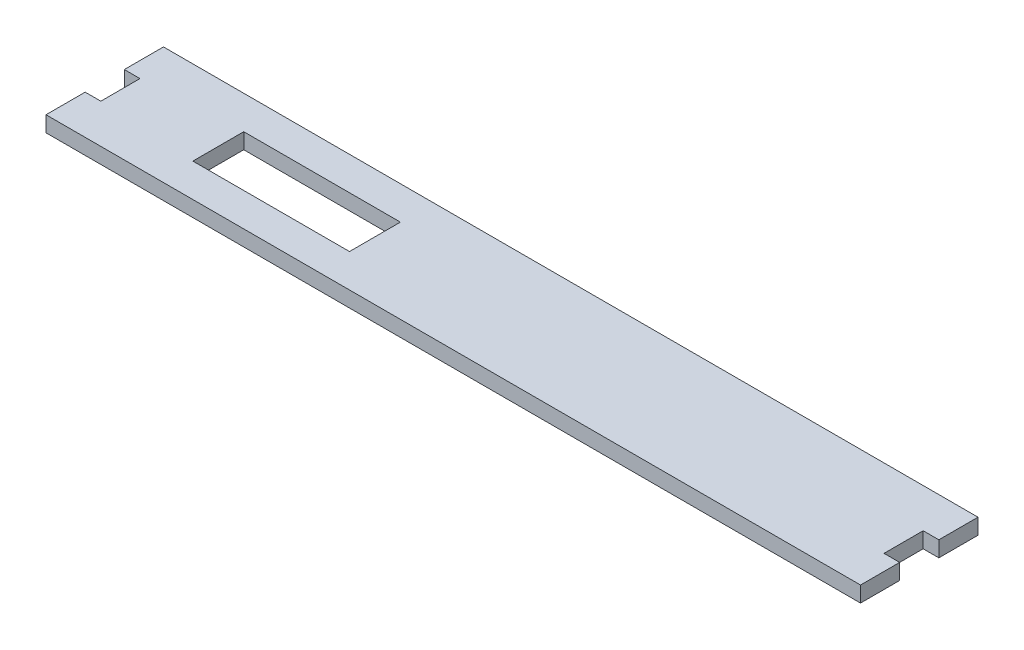
ISO-10303-21;
HEADER;
FILE_DESCRIPTION(('STEP AP214'),'2;1');
FILE_NAME('part.step','',(''),(''),'','','');
FILE_SCHEMA(('AUTOMOTIVE_DESIGN { 1 0 10303 214 1 1 1 1 }'));
ENDSEC;
DATA;
#1=APPLICATION_CONTEXT('core data for automotive mechanical design processes');
#2=APPLICATION_PROTOCOL_DEFINITION('international standard','automotive_design',2000,#1);
#3=PRODUCT_CONTEXT('',#1,'mechanical');
#4=PRODUCT('Part','Part','',(#3));
#5=PRODUCT_RELATED_PRODUCT_CATEGORY('part','',(#4));
#6=PRODUCT_DEFINITION_FORMATION('','',#4);
#7=PRODUCT_DEFINITION_CONTEXT('part definition',#1,'design');
#8=PRODUCT_DEFINITION('design','',#6,#7);
#9=PRODUCT_DEFINITION_SHAPE('','',#8);
#10=(LENGTH_UNIT() NAMED_UNIT(*) SI_UNIT(.MILLI.,.METRE.));
#11=(NAMED_UNIT(*) PLANE_ANGLE_UNIT() SI_UNIT($,.RADIAN.));
#12=(NAMED_UNIT(*) SI_UNIT($,.STERADIAN.) SOLID_ANGLE_UNIT());
#13=UNCERTAINTY_MEASURE_WITH_UNIT(LENGTH_MEASURE(1.E-05),#10,'distance_accuracy_value','');
#14=(GEOMETRIC_REPRESENTATION_CONTEXT(3) GLOBAL_UNCERTAINTY_ASSIGNED_CONTEXT((#13)) GLOBAL_UNIT_ASSIGNED_CONTEXT((#10,
#11,#12)) REPRESENTATION_CONTEXT('',''));
#15=CARTESIAN_POINT('',(0.,0.,0.));
#16=DIRECTION('',(0.,0.,1.));
#17=DIRECTION('',(1.,0.,0.));
#18=AXIS2_PLACEMENT_3D('',#15,#16,#17);
#19=CARTESIAN_POINT('',(-63.6015694046225,4.,-21.5));
#20=DIRECTION('',(0.,0.,-1.));
#21=DIRECTION('',(-1.,0.,0.));
#22=AXIS2_PLACEMENT_3D('',#19,#20,#21);
#23=PLANE('',#22);
#24=DIRECTION('',(1.,0.,0.));
#25=VECTOR('',#24,1.);
#26=CARTESIAN_POINT('',(-63.6015694046225,0.,-21.5));
#27=LINE('',#26,#25);
#28=CARTESIAN_POINT('',(25.,0.,-21.5));
#29=VERTEX_POINT('',#28);
#30=CARTESIAN_POINT('',(65.,0.,-21.5));
#31=VERTEX_POINT('',#30);
#32=EDGE_CURVE('E189',#29,#31,#27,.T.);
#33=ORIENTED_EDGE('',*,*,#32,.T.);
#34=DIRECTION('',(0.,-1.,0.));
#35=VECTOR('',#34,1.);
#36=CARTESIAN_POINT('',(65.,4.,-21.5));
#37=LINE('',#36,#35);
#38=CARTESIAN_POINT('',(65.,4.,-21.5));
#39=VERTEX_POINT('',#38);
#40=EDGE_CURVE('E84',#39,#31,#37,.T.);
#41=ORIENTED_EDGE('',*,*,#40,.F.);
#42=DIRECTION('',(1.,0.,0.));
#43=VECTOR('',#42,1.);
#44=CARTESIAN_POINT('',(-63.6015694046225,4.,-21.5));
#45=LINE('',#44,#43);
#46=CARTESIAN_POINT('',(25.,4.,-21.5));
#47=VERTEX_POINT('',#46);
#48=EDGE_CURVE('E225',#47,#39,#45,.T.);
#49=ORIENTED_EDGE('',*,*,#48,.F.);
#50=DIRECTION('',(0.,-1.,0.));
#51=VECTOR('',#50,1.);
#52=CARTESIAN_POINT('',(25.,4.,-21.5));
#53=LINE('',#52,#51);
#54=EDGE_CURVE('E145',#47,#29,#53,.T.);
#55=ORIENTED_EDGE('',*,*,#54,.T.);
#56=EDGE_LOOP('',(#33,#41,#49,#55));
#57=FACE_BOUND('',#56,.T.);
#58=ADVANCED_FACE('F74',(#57),#23,.F.);
#59=CARTESIAN_POINT('',(65.,4.,-15.));
#60=DIRECTION('',(1.,0.,0.));
#61=DIRECTION('',(0.,0.,-1.));
#62=AXIS2_PLACEMENT_3D('',#59,#60,#61);
#63=PLANE('',#62);
#64=DIRECTION('',(0.,0.,1.));
#65=VECTOR('',#64,1.);
#66=CARTESIAN_POINT('',(65.,0.,-15.));
#67=LINE('',#66,#65);
#68=CARTESIAN_POINT('',(65.,0.,-8.5));
#69=VERTEX_POINT('',#68);
#70=EDGE_CURVE('E186',#31,#69,#67,.T.);
#71=ORIENTED_EDGE('',*,*,#70,.T.);
#72=DIRECTION('',(0.,-1.,0.));
#73=VECTOR('',#72,1.);
#74=CARTESIAN_POINT('',(65.,4.,-8.5));
#75=LINE('',#74,#73);
#76=CARTESIAN_POINT('',(65.,4.,-8.5));
#77=VERTEX_POINT('',#76);
#78=EDGE_CURVE('E171',#77,#69,#75,.T.);
#79=ORIENTED_EDGE('',*,*,#78,.F.);
#80=DIRECTION('',(0.,0.,1.));
#81=VECTOR('',#80,1.);
#82=CARTESIAN_POINT('',(65.,4.,-15.));
#83=LINE('',#82,#81);
#84=EDGE_CURVE('E222',#39,#77,#83,.T.);
#85=ORIENTED_EDGE('',*,*,#84,.F.);
#86=ORIENTED_EDGE('',*,*,#40,.T.);
#87=EDGE_LOOP('',(#71,#79,#85,#86));
#88=FACE_BOUND('',#87,.T.);
#89=ADVANCED_FACE('F450',(#88),#63,.F.);
#90=CARTESIAN_POINT('',(-63.6015694046225,4.,-8.5));
#91=DIRECTION('',(0.,0.,-1.));
#92=DIRECTION('',(-1.,0.,0.));
#93=AXIS2_PLACEMENT_3D('',#90,#91,#92);
#94=PLANE('',#93);
#95=DIRECTION('',(1.,0.,0.));
#96=VECTOR('',#95,1.);
#97=CARTESIAN_POINT('',(-63.6015694046225,0.,-8.5));
#98=LINE('',#97,#96);
#99=CARTESIAN_POINT('',(25.,0.,-8.5));
#100=VERTEX_POINT('',#99);
#101=EDGE_CURVE('E183',#100,#69,#98,.T.);
#102=ORIENTED_EDGE('',*,*,#101,.F.);
#103=DIRECTION('',(0.,-1.,0.));
#104=VECTOR('',#103,1.);
#105=CARTESIAN_POINT('',(25.,4.,-8.5));
#106=LINE('',#105,#104);
#107=CARTESIAN_POINT('',(25.,4.,-8.5));
#108=VERTEX_POINT('',#107);
#109=EDGE_CURVE('E174',#108,#100,#106,.T.);
#110=ORIENTED_EDGE('',*,*,#109,.F.);
#111=DIRECTION('',(1.,0.,0.));
#112=VECTOR('',#111,1.);
#113=CARTESIAN_POINT('',(-63.6015694046225,4.,-8.5));
#114=LINE('',#113,#112);
#115=EDGE_CURVE('E219',#108,#77,#114,.T.);
#116=ORIENTED_EDGE('',*,*,#115,.T.);
#117=ORIENTED_EDGE('',*,*,#78,.T.);
#118=EDGE_LOOP('',(#102,#110,#116,#117));
#119=FACE_BOUND('',#118,.T.);
#120=ADVANCED_FACE('F360',(#119),#94,.T.);
#121=CARTESIAN_POINT('',(-63.6015694046225,4.,0.));
#122=DIRECTION('',(0.,0.,-1.));
#123=DIRECTION('',(-1.,0.,0.));
#124=AXIS2_PLACEMENT_3D('',#121,#122,#123);
#125=PLANE('',#124);
#126=DIRECTION('',(1.,0.,0.));
#127=VECTOR('',#126,1.);
#128=CARTESIAN_POINT('',(-63.6015694046225,0.,0.));
#129=LINE('',#128,#127);
#130=CARTESIAN_POINT('',(-4.,0.,0.));
#131=VERTEX_POINT('',#130);
#132=CARTESIAN_POINT('',(204.,0.,0.));
#133=VERTEX_POINT('',#132);
#134=EDGE_CURVE('E112',#131,#133,#129,.T.);
#135=ORIENTED_EDGE('',*,*,#134,.T.);
#136=DIRECTION('',(0.,-1.,0.));
#137=VECTOR('',#136,1.);
#138=CARTESIAN_POINT('',(204.,4.,0.));
#139=LINE('',#138,#137);
#140=CARTESIAN_POINT('',(204.,4.,0.));
#141=VERTEX_POINT('',#140);
#142=EDGE_CURVE('E116',#141,#133,#139,.T.);
#143=ORIENTED_EDGE('',*,*,#142,.F.);
#144=DIRECTION('',(1.,0.,0.));
#145=VECTOR('',#144,1.);
#146=CARTESIAN_POINT('',(-63.6015694046225,4.,0.));
#147=LINE('',#146,#145);
#148=CARTESIAN_POINT('',(-4.,4.,0.));
#149=VERTEX_POINT('',#148);
#150=EDGE_CURVE('E182',#149,#141,#147,.T.);
#151=ORIENTED_EDGE('',*,*,#150,.F.);
#152=DIRECTION('',(0.,-1.,0.));
#153=VECTOR('',#152,1.);
#154=CARTESIAN_POINT('',(-4.,4.,0.));
#155=LINE('',#154,#153);
#156=EDGE_CURVE('E120',#149,#131,#155,.T.);
#157=ORIENTED_EDGE('',*,*,#156,.T.);
#158=EDGE_LOOP('',(#135,#143,#151,#157));
#159=FACE_BOUND('',#158,.T.);
#160=ADVANCED_FACE('F114',(#159),#125,.F.);
#161=CARTESIAN_POINT('',(200.,4.,-15.));
#162=DIRECTION('',(-1.,0.,0.));
#163=DIRECTION('',(0.,0.,1.));
#164=AXIS2_PLACEMENT_3D('',#161,#162,#163);
#165=PLANE('',#164);
#166=DIRECTION('',(0.,0.,-1.));
#167=VECTOR('',#166,1.);
#168=CARTESIAN_POINT('',(200.,4.,-15.));
#169=LINE('',#168,#167);
#170=CARTESIAN_POINT('',(200.,4.,-10.));
#171=VERTEX_POINT('',#170);
#172=CARTESIAN_POINT('',(200.,4.,-20.));
#173=VERTEX_POINT('',#172);
#174=EDGE_CURVE('E252',#171,#173,#169,.T.);
#175=ORIENTED_EDGE('',*,*,#174,.F.);
#176=DIRECTION('',(0.,-1.,0.));
#177=VECTOR('',#176,1.);
#178=CARTESIAN_POINT('',(200.,4.,-10.));
#179=LINE('',#178,#177);
#180=CARTESIAN_POINT('',(200.,0.,-10.));
#181=VERTEX_POINT('',#180);
#182=EDGE_CURVE('E12',#171,#181,#179,.T.);
#183=ORIENTED_EDGE('',*,*,#182,.T.);
#184=DIRECTION('',(0.,0.,-1.));
#185=VECTOR('',#184,1.);
#186=CARTESIAN_POINT('',(200.,0.,-15.));
#187=LINE('',#186,#185);
#188=CARTESIAN_POINT('',(200.,0.,-20.));
#189=VERTEX_POINT('',#188);
#190=EDGE_CURVE('E125',#181,#189,#187,.T.);
#191=ORIENTED_EDGE('',*,*,#190,.T.);
#192=DIRECTION('',(0.,-1.,0.));
#193=VECTOR('',#192,1.);
#194=CARTESIAN_POINT('',(200.,4.,-20.));
#195=LINE('',#194,#193);
#196=EDGE_CURVE('E142',#173,#189,#195,.T.);
#197=ORIENTED_EDGE('',*,*,#196,.F.);
#198=EDGE_LOOP('',(#175,#183,#191,#197));
#199=FACE_BOUND('',#198,.T.);
#200=ADVANCED_FACE('F359',(#199),#165,.F.);
#201=CARTESIAN_POINT('',(-63.6015694046225,4.,-20.));
#202=DIRECTION('',(0.,0.,-1.));
#203=DIRECTION('',(-1.,0.,0.));
#204=AXIS2_PLACEMENT_3D('',#201,#202,#203);
#205=PLANE('',#204);
#206=DIRECTION('',(1.,0.,0.));
#207=VECTOR('',#206,1.);
#208=CARTESIAN_POINT('',(-63.6015694046225,0.,-20.));
#209=LINE('',#208,#207);
#210=CARTESIAN_POINT('',(204.,0.,-20.));
#211=VERTEX_POINT('',#210);
#212=EDGE_CURVE('E212',#189,#211,#209,.T.);
#213=ORIENTED_EDGE('',*,*,#212,.T.);
#214=DIRECTION('',(0.,-1.,0.));
#215=VECTOR('',#214,1.);
#216=CARTESIAN_POINT('',(204.,4.,-20.));
#217=LINE('',#216,#215);
#218=CARTESIAN_POINT('',(204.,4.,-20.));
#219=VERTEX_POINT('',#218);
#220=EDGE_CURVE('E146',#219,#211,#217,.T.);
#221=ORIENTED_EDGE('',*,*,#220,.F.);
#222=DIRECTION('',(1.,0.,0.));
#223=VECTOR('',#222,1.);
#224=CARTESIAN_POINT('',(-63.6015694046225,4.,-20.));
#225=LINE('',#224,#223);
#226=EDGE_CURVE('E249',#173,#219,#225,.T.);
#227=ORIENTED_EDGE('',*,*,#226,.F.);
#228=ORIENTED_EDGE('',*,*,#196,.T.);
#229=EDGE_LOOP('',(#213,#221,#227,#228));
#230=FACE_BOUND('',#229,.T.);
#231=ADVANCED_FACE('F363',(#230),#205,.F.);
#232=CARTESIAN_POINT('',(204.,4.,-15.));
#233=DIRECTION('',(1.,0.,0.));
#234=DIRECTION('',(0.,0.,-1.));
#235=AXIS2_PLACEMENT_3D('',#232,#233,#234);
#236=PLANE('',#235);
#237=DIRECTION('',(0.,0.,1.));
#238=VECTOR('',#237,1.);
#239=CARTESIAN_POINT('',(204.,0.,-15.));
#240=LINE('',#239,#238);
#241=CARTESIAN_POINT('',(204.,0.,-30.));
#242=VERTEX_POINT('',#241);
#243=EDGE_CURVE('E209',#242,#211,#240,.T.);
#244=ORIENTED_EDGE('',*,*,#243,.F.);
#245=DIRECTION('',(0.,-1.,0.));
#246=VECTOR('',#245,1.);
#247=CARTESIAN_POINT('',(204.,4.,-30.));
#248=LINE('',#247,#246);
#249=CARTESIAN_POINT('',(204.,4.,-30.));
#250=VERTEX_POINT('',#249);
#251=EDGE_CURVE('E149',#250,#242,#248,.T.);
#252=ORIENTED_EDGE('',*,*,#251,.F.);
#253=DIRECTION('',(0.,0.,1.));
#254=VECTOR('',#253,1.);
#255=CARTESIAN_POINT('',(204.,4.,-15.));
#256=LINE('',#255,#254);
#257=EDGE_CURVE('E246',#250,#219,#256,.T.);
#258=ORIENTED_EDGE('',*,*,#257,.T.);
#259=ORIENTED_EDGE('',*,*,#220,.T.);
#260=EDGE_LOOP('',(#244,#252,#258,#259));
#261=FACE_BOUND('',#260,.T.);
#262=ADVANCED_FACE('F367',(#261),#236,.T.);
#263=CARTESIAN_POINT('',(-63.6015694046225,4.,-30.));
#264=DIRECTION('',(0.,0.,-1.));
#265=DIRECTION('',(-1.,0.,0.));
#266=AXIS2_PLACEMENT_3D('',#263,#264,#265);
#267=PLANE('',#266);
#268=DIRECTION('',(1.,0.,0.));
#269=VECTOR('',#268,1.);
#270=CARTESIAN_POINT('',(-63.6015694046225,0.,-30.));
#271=LINE('',#270,#269);
#272=CARTESIAN_POINT('',(-4.,0.,-30.));
#273=VERTEX_POINT('',#272);
#274=EDGE_CURVE('E206',#273,#242,#271,.T.);
#275=ORIENTED_EDGE('',*,*,#274,.F.);
#276=DIRECTION('',(0.,-1.,0.));
#277=VECTOR('',#276,1.);
#278=CARTESIAN_POINT('',(-4.,4.,-30.));
#279=LINE('',#278,#277);
#280=CARTESIAN_POINT('',(-4.,4.,-30.));
#281=VERTEX_POINT('',#280);
#282=EDGE_CURVE('E152',#281,#273,#279,.T.);
#283=ORIENTED_EDGE('',*,*,#282,.F.);
#284=DIRECTION('',(1.,0.,0.));
#285=VECTOR('',#284,1.);
#286=CARTESIAN_POINT('',(-63.6015694046225,4.,-30.));
#287=LINE('',#286,#285);
#288=EDGE_CURVE('E243',#281,#250,#287,.T.);
#289=ORIENTED_EDGE('',*,*,#288,.T.);
#290=ORIENTED_EDGE('',*,*,#251,.T.);
#291=EDGE_LOOP('',(#275,#283,#289,#290));
#292=FACE_BOUND('',#291,.T.);
#293=ADVANCED_FACE('F371',(#292),#267,.T.);
#294=CARTESIAN_POINT('',(-4.,4.,-15.));
#295=DIRECTION('',(1.,0.,0.));
#296=DIRECTION('',(0.,0.,-1.));
#297=AXIS2_PLACEMENT_3D('',#294,#295,#296);
#298=PLANE('',#297);
#299=DIRECTION('',(0.,0.,1.));
#300=VECTOR('',#299,1.);
#301=CARTESIAN_POINT('',(-4.,0.,-15.));
#302=LINE('',#301,#300);
#303=CARTESIAN_POINT('',(-4.,0.,-20.));
#304=VERTEX_POINT('',#303);
#305=EDGE_CURVE('E203',#273,#304,#302,.T.);
#306=ORIENTED_EDGE('',*,*,#305,.T.);
#307=DIRECTION('',(0.,-1.,0.));
#308=VECTOR('',#307,1.);
#309=CARTESIAN_POINT('',(-4.,4.,-20.));
#310=LINE('',#309,#308);
#311=CARTESIAN_POINT('',(-4.,4.,-20.));
#312=VERTEX_POINT('',#311);
#313=EDGE_CURVE('E155',#312,#304,#310,.T.);
#314=ORIENTED_EDGE('',*,*,#313,.F.);
#315=DIRECTION('',(0.,0.,1.));
#316=VECTOR('',#315,1.);
#317=CARTESIAN_POINT('',(-4.,4.,-15.));
#318=LINE('',#317,#316);
#319=EDGE_CURVE('E240',#281,#312,#318,.T.);
#320=ORIENTED_EDGE('',*,*,#319,.F.);
#321=ORIENTED_EDGE('',*,*,#282,.T.);
#322=EDGE_LOOP('',(#306,#314,#320,#321));
#323=FACE_BOUND('',#322,.T.);
#324=ADVANCED_FACE('F375',(#323),#298,.F.);
#325=CARTESIAN_POINT('',(-63.6015694046225,4.,-20.));
#326=DIRECTION('',(0.,0.,1.));
#327=DIRECTION('',(1.,0.,0.));
#328=AXIS2_PLACEMENT_3D('',#325,#326,#327);
#329=PLANE('',#328);
#330=DIRECTION('',(-1.,0.,0.));
#331=VECTOR('',#330,1.);
#332=CARTESIAN_POINT('',(-63.6015694046225,0.,-20.));
#333=LINE('',#332,#331);
#334=CARTESIAN_POINT('',(0.,0.,-20.));
#335=VERTEX_POINT('',#334);
#336=EDGE_CURVE('E200',#335,#304,#333,.T.);
#337=ORIENTED_EDGE('',*,*,#336,.F.);
#338=DIRECTION('',(0.,-1.,0.));
#339=VECTOR('',#338,1.);
#340=CARTESIAN_POINT('',(0.,4.,-20.));
#341=LINE('',#340,#339);
#342=CARTESIAN_POINT('',(0.,4.,-20.));
#343=VERTEX_POINT('',#342);
#344=EDGE_CURVE('E158',#343,#335,#341,.T.);
#345=ORIENTED_EDGE('',*,*,#344,.F.);
#346=DIRECTION('',(-1.,0.,0.));
#347=VECTOR('',#346,1.);
#348=CARTESIAN_POINT('',(-63.6015694046225,4.,-20.));
#349=LINE('',#348,#347);
#350=EDGE_CURVE('E237',#343,#312,#349,.T.);
#351=ORIENTED_EDGE('',*,*,#350,.T.);
#352=ORIENTED_EDGE('',*,*,#313,.T.);
#353=EDGE_LOOP('',(#337,#345,#351,#352));
#354=FACE_BOUND('',#353,.T.);
#355=ADVANCED_FACE('F336',(#354),#329,.T.);
#356=CARTESIAN_POINT('',(0.,4.,-15.));
#357=DIRECTION('',(-1.,0.,0.));
#358=DIRECTION('',(0.,0.,1.));
#359=AXIS2_PLACEMENT_3D('',#356,#357,#358);
#360=PLANE('',#359);
#361=DIRECTION('',(0.,0.,-1.));
#362=VECTOR('',#361,1.);
#363=CARTESIAN_POINT('',(0.,0.,-15.));
#364=LINE('',#363,#362);
#365=CARTESIAN_POINT('',(0.,0.,-10.));
#366=VERTEX_POINT('',#365);
#367=EDGE_CURVE('E197',#366,#335,#364,.T.);
#368=ORIENTED_EDGE('',*,*,#367,.F.);
#369=DIRECTION('',(0.,-1.,0.));
#370=VECTOR('',#369,1.);
#371=CARTESIAN_POINT('',(0.,4.,-10.));
#372=LINE('',#371,#370);
#373=CARTESIAN_POINT('',(0.,4.,-10.));
#374=VERTEX_POINT('',#373);
#375=EDGE_CURVE('E161',#374,#366,#372,.T.);
#376=ORIENTED_EDGE('',*,*,#375,.F.);
#377=DIRECTION('',(0.,0.,-1.));
#378=VECTOR('',#377,1.);
#379=CARTESIAN_POINT('',(0.,4.,-15.));
#380=LINE('',#379,#378);
#381=EDGE_CURVE('E234',#374,#343,#380,.T.);
#382=ORIENTED_EDGE('',*,*,#381,.T.);
#383=ORIENTED_EDGE('',*,*,#344,.T.);
#384=EDGE_LOOP('',(#368,#376,#382,#383));
#385=FACE_BOUND('',#384,.T.);
#386=ADVANCED_FACE('F324',(#385),#360,.T.);
#387=CARTESIAN_POINT('',(-63.6015694046225,4.,-10.));
#388=DIRECTION('',(0.,0.,1.));
#389=DIRECTION('',(1.,0.,0.));
#390=AXIS2_PLACEMENT_3D('',#387,#388,#389);
#391=PLANE('',#390);
#392=DIRECTION('',(-1.,0.,0.));
#393=VECTOR('',#392,1.);
#394=CARTESIAN_POINT('',(-63.6015694046225,0.,-10.));
#395=LINE('',#394,#393);
#396=CARTESIAN_POINT('',(-4.,0.,-10.));
#397=VERTEX_POINT('',#396);
#398=EDGE_CURVE('E194',#366,#397,#395,.T.);
#399=ORIENTED_EDGE('',*,*,#398,.T.);
#400=DIRECTION('',(0.,-1.,0.));
#401=VECTOR('',#400,1.);
#402=CARTESIAN_POINT('',(-4.,4.,-10.));
#403=LINE('',#402,#401);
#404=CARTESIAN_POINT('',(-4.,4.,-10.));
#405=VERTEX_POINT('',#404);
#406=EDGE_CURVE('E164',#405,#397,#403,.T.);
#407=ORIENTED_EDGE('',*,*,#406,.F.);
#408=DIRECTION('',(-1.,0.,0.));
#409=VECTOR('',#408,1.);
#410=CARTESIAN_POINT('',(-63.6015694046225,4.,-10.));
#411=LINE('',#410,#409);
#412=EDGE_CURVE('E231',#374,#405,#411,.T.);
#413=ORIENTED_EDGE('',*,*,#412,.F.);
#414=ORIENTED_EDGE('',*,*,#375,.T.);
#415=EDGE_LOOP('',(#399,#407,#413,#414));
#416=FACE_BOUND('',#415,.T.);
#417=ADVANCED_FACE('F329',(#416),#391,.F.);
#418=CARTESIAN_POINT('',(-4.,4.,-15.));
#419=DIRECTION('',(-1.,0.,0.));
#420=DIRECTION('',(0.,0.,1.));
#421=AXIS2_PLACEMENT_3D('',#418,#419,#420);
#422=PLANE('',#421);
#423=DIRECTION('',(0.,0.,-1.));
#424=VECTOR('',#423,1.);
#425=CARTESIAN_POINT('',(-4.,0.,-15.));
#426=LINE('',#425,#424);
#427=EDGE_CURVE('E192',#131,#397,#426,.T.);
#428=ORIENTED_EDGE('',*,*,#427,.F.);
#429=ORIENTED_EDGE('',*,*,#156,.F.);
#430=DIRECTION('',(0.,0.,-1.));
#431=VECTOR('',#430,1.);
#432=CARTESIAN_POINT('',(-4.,4.,-15.));
#433=LINE('',#432,#431);
#434=EDGE_CURVE('E228',#149,#405,#433,.T.);
#435=ORIENTED_EDGE('',*,*,#434,.T.);
#436=ORIENTED_EDGE('',*,*,#406,.T.);
#437=EDGE_LOOP('',(#428,#429,#435,#436));
#438=FACE_BOUND('',#437,.T.);
#439=ADVANCED_FACE('F338',(#438),#422,.T.);
#440=CARTESIAN_POINT('',(25.,4.,-15.));
#441=DIRECTION('',(1.,0.,0.));
#442=DIRECTION('',(0.,0.,-1.));
#443=AXIS2_PLACEMENT_3D('',#440,#441,#442);
#444=PLANE('',#443);
#445=DIRECTION('',(0.,0.,1.));
#446=VECTOR('',#445,1.);
#447=CARTESIAN_POINT('',(25.,0.,-15.));
#448=LINE('',#447,#446);
#449=EDGE_CURVE('E179',#29,#100,#448,.T.);
#450=ORIENTED_EDGE('',*,*,#449,.F.);
#451=ORIENTED_EDGE('',*,*,#54,.F.);
#452=DIRECTION('',(0.,0.,1.));
#453=VECTOR('',#452,1.);
#454=CARTESIAN_POINT('',(25.,4.,-15.));
#455=LINE('',#454,#453);
#456=EDGE_CURVE('E168',#47,#108,#455,.T.);
#457=ORIENTED_EDGE('',*,*,#456,.T.);
#458=ORIENTED_EDGE('',*,*,#109,.T.);
#459=EDGE_LOOP('',(#450,#451,#457,#458));
#460=FACE_BOUND('',#459,.T.);
#461=ADVANCED_FACE('F340',(#460),#444,.T.);
#462=CARTESIAN_POINT('',(-63.6015694046225,4.,-15.));
#463=DIRECTION('',(0.,1.,0.));
#464=DIRECTION('',(0.,0.,1.));
#465=AXIS2_PLACEMENT_3D('',#462,#463,#464);
#466=PLANE('',#465);
#467=ORIENTED_EDGE('',*,*,#150,.T.);
#468=DIRECTION('',(0.,0.,-1.));
#469=VECTOR('',#468,1.);
#470=CARTESIAN_POINT('',(204.,4.,0.));
#471=LINE('',#470,#469);
#472=CARTESIAN_POINT('',(204.,4.,-10.));
#473=VERTEX_POINT('',#472);
#474=EDGE_CURVE('E131',#141,#473,#471,.T.);
#475=ORIENTED_EDGE('',*,*,#474,.T.);
#476=DIRECTION('',(1.,0.,0.));
#477=VECTOR('',#476,1.);
#478=CARTESIAN_POINT('',(200.,4.,-10.));
#479=LINE('',#478,#477);
#480=EDGE_CURVE('E136',#171,#473,#479,.T.);
#481=ORIENTED_EDGE('',*,*,#480,.F.);
#482=ORIENTED_EDGE('',*,*,#174,.T.);
#483=ORIENTED_EDGE('',*,*,#226,.T.);
#484=ORIENTED_EDGE('',*,*,#257,.F.);
#485=ORIENTED_EDGE('',*,*,#288,.F.);
#486=ORIENTED_EDGE('',*,*,#319,.T.);
#487=ORIENTED_EDGE('',*,*,#350,.F.);
#488=ORIENTED_EDGE('',*,*,#381,.F.);
#489=ORIENTED_EDGE('',*,*,#412,.T.);
#490=ORIENTED_EDGE('',*,*,#434,.F.);
#491=EDGE_LOOP('',(#467,#475,#481,#482,#483,#484,#485,#486,#487,#488,#489,#490));
#492=FACE_BOUND('',#491,.T.);
#493=ORIENTED_EDGE('',*,*,#48,.T.);
#494=ORIENTED_EDGE('',*,*,#84,.T.);
#495=ORIENTED_EDGE('',*,*,#115,.F.);
#496=ORIENTED_EDGE('',*,*,#456,.F.);
#497=EDGE_LOOP('',(#493,#494,#495,#496));
#498=FACE_BOUND('',#497,.T.);
#499=ADVANCED_FACE('F257',(#492,#498),#466,.T.);
#500=CARTESIAN_POINT('',(-63.6015694046225,0.,-15.));
#501=DIRECTION('',(0.,1.,0.));
#502=DIRECTION('',(0.,0.,1.));
#503=AXIS2_PLACEMENT_3D('',#500,#501,#502);
#504=PLANE('',#503);
#505=ORIENTED_EDGE('',*,*,#134,.F.);
#506=ORIENTED_EDGE('',*,*,#427,.T.);
#507=ORIENTED_EDGE('',*,*,#398,.F.);
#508=ORIENTED_EDGE('',*,*,#367,.T.);
#509=ORIENTED_EDGE('',*,*,#336,.T.);
#510=ORIENTED_EDGE('',*,*,#305,.F.);
#511=ORIENTED_EDGE('',*,*,#274,.T.);
#512=ORIENTED_EDGE('',*,*,#243,.T.);
#513=ORIENTED_EDGE('',*,*,#212,.F.);
#514=ORIENTED_EDGE('',*,*,#190,.F.);
#515=DIRECTION('',(1.,0.,0.));
#516=VECTOR('',#515,1.);
#517=CARTESIAN_POINT('',(200.,0.,-10.));
#518=LINE('',#517,#516);
#519=CARTESIAN_POINT('',(204.,0.,-10.));
#520=VERTEX_POINT('',#519);
#521=EDGE_CURVE('E135',#181,#520,#518,.T.);
#522=ORIENTED_EDGE('',*,*,#521,.T.);
#523=DIRECTION('',(0.,0.,-1.));
#524=VECTOR('',#523,1.);
#525=CARTESIAN_POINT('',(204.,0.,0.));
#526=LINE('',#525,#524);
#527=EDGE_CURVE('E129',#133,#520,#526,.T.);
#528=ORIENTED_EDGE('',*,*,#527,.F.);
#529=EDGE_LOOP('',(#505,#506,#507,#508,#509,#510,#511,#512,#513,#514,#522,#528));
#530=FACE_BOUND('',#529,.T.);
#531=ORIENTED_EDGE('',*,*,#32,.F.);
#532=ORIENTED_EDGE('',*,*,#449,.T.);
#533=ORIENTED_EDGE('',*,*,#101,.T.);
#534=ORIENTED_EDGE('',*,*,#70,.F.);
#535=EDGE_LOOP('',(#531,#532,#533,#534));
#536=FACE_BOUND('',#535,.T.);
#537=ADVANCED_FACE('F132',(#530,#536),#504,.F.);
#538=CARTESIAN_POINT('',(204.,4.,0.));
#539=DIRECTION('',(-1.,0.,0.));
#540=DIRECTION('',(0.,0.,1.));
#541=AXIS2_PLACEMENT_3D('',#538,#539,#540);
#542=PLANE('',#541);
#543=ORIENTED_EDGE('',*,*,#527,.T.);
#544=DIRECTION('',(0.,-1.,0.));
#545=VECTOR('',#544,1.);
#546=CARTESIAN_POINT('',(204.,4.,-10.));
#547=LINE('',#546,#545);
#548=EDGE_CURVE('E78',#473,#520,#547,.T.);
#549=ORIENTED_EDGE('',*,*,#548,.F.);
#550=ORIENTED_EDGE('',*,*,#474,.F.);
#551=ORIENTED_EDGE('',*,*,#142,.T.);
#552=EDGE_LOOP('',(#543,#549,#550,#551));
#553=FACE_BOUND('',#552,.T.);
#554=ADVANCED_FACE('F128',(#553),#542,.F.);
#555=CARTESIAN_POINT('',(200.,4.,-10.));
#556=DIRECTION('',(0.,0.,-1.));
#557=DIRECTION('',(-1.,0.,0.));
#558=AXIS2_PLACEMENT_3D('',#555,#556,#557);
#559=PLANE('',#558);
#560=ORIENTED_EDGE('',*,*,#521,.F.);
#561=ORIENTED_EDGE('',*,*,#182,.F.);
#562=ORIENTED_EDGE('',*,*,#480,.T.);
#563=ORIENTED_EDGE('',*,*,#548,.T.);
#564=EDGE_LOOP('',(#560,#561,#562,#563));
#565=FACE_BOUND('',#564,.T.);
#566=ADVANCED_FACE('F76',(#565),#559,.T.);
#567=CLOSED_SHELL('',(#58,#89,#120,#160,#200,#231,#262,#293,#324,#355,#386,#417,#439,#461,#499,
#537,#554,#566));
#568=MANIFOLD_SOLID_BREP('B2',#567);
#569=ADVANCED_BREP_SHAPE_REPRESENTATION('',(#18,#568),#14);
#570=SHAPE_DEFINITION_REPRESENTATION(#9,#569);
ENDSEC;
END-ISO-10303-21;
